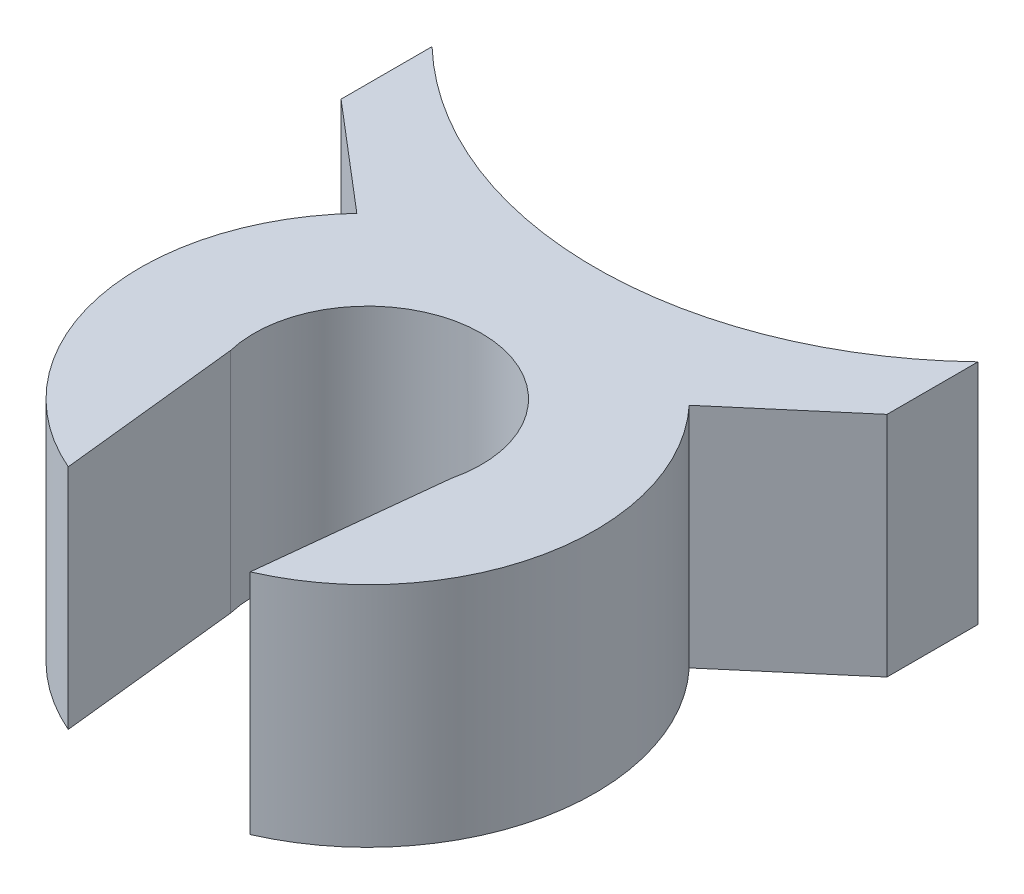
ISO-10303-21;
HEADER;
FILE_DESCRIPTION(('STEP AP214'),'2;1');
FILE_NAME('part.step','',(''),(''),'','','');
FILE_SCHEMA(('AUTOMOTIVE_DESIGN { 1 0 10303 214 1 1 1 1 }'));
ENDSEC;
DATA;
#1=APPLICATION_CONTEXT('core data for automotive mechanical design processes');
#2=APPLICATION_PROTOCOL_DEFINITION('international standard','automotive_design',2000,#1);
#3=PRODUCT_CONTEXT('',#1,'mechanical');
#4=PRODUCT('Part','Part','',(#3));
#5=PRODUCT_RELATED_PRODUCT_CATEGORY('part','',(#4));
#6=PRODUCT_DEFINITION_FORMATION('','',#4);
#7=PRODUCT_DEFINITION_CONTEXT('part definition',#1,'design');
#8=PRODUCT_DEFINITION('design','',#6,#7);
#9=PRODUCT_DEFINITION_SHAPE('','',#8);
#10=(LENGTH_UNIT() NAMED_UNIT(*) SI_UNIT(.MILLI.,.METRE.));
#11=(NAMED_UNIT(*) PLANE_ANGLE_UNIT() SI_UNIT($,.RADIAN.));
#12=(NAMED_UNIT(*) SI_UNIT($,.STERADIAN.) SOLID_ANGLE_UNIT());
#13=UNCERTAINTY_MEASURE_WITH_UNIT(LENGTH_MEASURE(1.E-05),#10,'distance_accuracy_value','');
#14=(GEOMETRIC_REPRESENTATION_CONTEXT(3) GLOBAL_UNCERTAINTY_ASSIGNED_CONTEXT((#13)) GLOBAL_UNIT_ASSIGNED_CONTEXT((#10,
#11,#12)) REPRESENTATION_CONTEXT('',''));
#15=CARTESIAN_POINT('',(0.,0.,0.));
#16=DIRECTION('',(0.,0.,1.));
#17=DIRECTION('',(1.,0.,0.));
#18=AXIS2_PLACEMENT_3D('',#15,#16,#17);
#19=CARTESIAN_POINT('',(0.,5.,0.));
#20=DIRECTION('',(0.,-1.,0.));
#21=DIRECTION('',(0.,0.,-1.));
#22=AXIS2_PLACEMENT_3D('',#19,#20,#21);
#23=CYLINDRICAL_SURFACE('',#22,5.);
#24=DIRECTION('',(0.,1.,0.));
#25=VECTOR('',#24,1.);
#26=CARTESIAN_POINT('',(-2.,-5.,4.58257569495584));
#27=LINE('',#26,#25);
#28=CARTESIAN_POINT('',(-2.,0.,4.58257569495584));
#29=VERTEX_POINT('',#28);
#30=CARTESIAN_POINT('',(-2.,5.,4.58257569495584));
#31=VERTEX_POINT('',#30);
#32=EDGE_CURVE('E205',#29,#31,#27,.T.);
#33=ORIENTED_EDGE('',*,*,#32,.T.);
#34=CARTESIAN_POINT('',(0.,5.,0.));
#35=DIRECTION('',(0.,1.,0.));
#36=DIRECTION('',(0.,0.,1.));
#37=AXIS2_PLACEMENT_3D('',#34,#35,#36);
#38=CIRCLE('',#37,5.);
#39=CARTESIAN_POINT('',(-3.65307531447136,5.,-3.41394797072245));
#40=VERTEX_POINT('',#39);
#41=EDGE_CURVE('E132',#40,#31,#38,.T.);
#42=ORIENTED_EDGE('',*,*,#41,.F.);
#43=DIRECTION('',(0.,-1.,0.));
#44=VECTOR('',#43,1.);
#45=CARTESIAN_POINT('',(-3.65307531447136,5.,-3.41394797072245));
#46=LINE('',#45,#44);
#47=CARTESIAN_POINT('',(-3.65307531447136,0.,-3.41394797072245));
#48=VERTEX_POINT('',#47);
#49=EDGE_CURVE('E155',#40,#48,#46,.T.);
#50=ORIENTED_EDGE('',*,*,#49,.T.);
#51=CARTESIAN_POINT('',(0.,0.,0.));
#52=DIRECTION('',(0.,1.,0.));
#53=DIRECTION('',(0.,0.,1.));
#54=AXIS2_PLACEMENT_3D('',#51,#52,#53);
#55=CIRCLE('',#54,5.);
#56=EDGE_CURVE('E148',#48,#29,#55,.T.);
#57=ORIENTED_EDGE('',*,*,#56,.T.);
#58=EDGE_LOOP('',(#33,#42,#50,#57));
#59=FACE_BOUND('',#58,.T.);
#60=ADVANCED_FACE('F37',(#59),#23,.T.);
#61=CARTESIAN_POINT('',(0.,5.,-13.6636384281383));
#62=DIRECTION('',(0.,1.,0.));
#63=DIRECTION('',(0.,0.,1.));
#64=AXIS2_PLACEMENT_3D('',#61,#62,#63);
#65=PLANE('',#64);
#66=DIRECTION('',(-0.761120289770479,0.,0.648610749602335));
#67=VECTOR('',#66,1.);
#68=CARTESIAN_POINT('',(3.65307531447136,5.,-3.41394797072246));
#69=LINE('',#68,#67);
#70=CARTESIAN_POINT('',(6.,5.,-5.41394797072245));
#71=VERTEX_POINT('',#70);
#72=CARTESIAN_POINT('',(3.65307531447136,5.,-3.41394797072246));
#73=VERTEX_POINT('',#72);
#74=EDGE_CURVE('E112',#71,#73,#69,.T.);
#75=ORIENTED_EDGE('',*,*,#74,.F.);
#76=DIRECTION('',(0.,0.,-1.));
#77=VECTOR('',#76,1.);
#78=CARTESIAN_POINT('',(6.,5.,-7.41394797072245));
#79=LINE('',#78,#77);
#80=CARTESIAN_POINT('',(6.,5.,-7.41394797072245));
#81=VERTEX_POINT('',#80);
#82=EDGE_CURVE('E120',#71,#81,#79,.T.);
#83=ORIENTED_EDGE('',*,*,#82,.T.);
#84=CARTESIAN_POINT('',(0.,5.,-13.6636384281383));
#85=DIRECTION('',(0.,-1.,0.));
#86=DIRECTION('',(0.,0.,1.));
#87=AXIS2_PLACEMENT_3D('',#84,#85,#86);
#88=CIRCLE('',#87,8.66363842813831);
#89=CARTESIAN_POINT('',(-6.,5.,-7.41394797072245));
#90=VERTEX_POINT('',#89);
#91=EDGE_CURVE('E152',#81,#90,#88,.T.);
#92=ORIENTED_EDGE('',*,*,#91,.T.);
#93=DIRECTION('',(0.,0.,1.));
#94=VECTOR('',#93,1.);
#95=CARTESIAN_POINT('',(-6.,5.,-7.41394797072245));
#96=LINE('',#95,#94);
#97=CARTESIAN_POINT('',(-6.,5.,-5.41394797072245));
#98=VERTEX_POINT('',#97);
#99=EDGE_CURVE('E184',#90,#98,#96,.T.);
#100=ORIENTED_EDGE('',*,*,#99,.T.);
#101=DIRECTION('',(-0.761120289770478,0.,-0.648610749602336));
#102=VECTOR('',#101,1.);
#103=CARTESIAN_POINT('',(-3.65307531447136,5.,-3.41394797072245));
#104=LINE('',#103,#102);
#105=EDGE_CURVE('E187',#40,#98,#104,.T.);
#106=ORIENTED_EDGE('',*,*,#105,.F.);
#107=ORIENTED_EDGE('',*,*,#41,.T.);
#108=DIRECTION('',(-0.107172581504937,0.,-0.994240432578342));
#109=VECTOR('',#108,1.);
#110=CARTESIAN_POINT('',(-2.4653258667171,5.,0.265745918924041));
#111=LINE('',#110,#109);
#112=CARTESIAN_POINT('',(-2.43117370001543,5.,0.582575694955839));
#113=VERTEX_POINT('',#112);
#114=EDGE_CURVE('E201',#31,#113,#111,.T.);
#115=ORIENTED_EDGE('',*,*,#114,.T.);
#116=CARTESIAN_POINT('',(0.,5.,0.));
#117=DIRECTION('',(0.,1.,0.));
#118=DIRECTION('',(0.,0.,1.));
#119=AXIS2_PLACEMENT_3D('',#116,#117,#118);
#120=CIRCLE('',#119,2.5);
#121=CARTESIAN_POINT('',(2.43117370001543,5.,0.582575694955839));
#122=VERTEX_POINT('',#121);
#123=EDGE_CURVE('E144',#122,#113,#120,.T.);
#124=ORIENTED_EDGE('',*,*,#123,.F.);
#125=DIRECTION('',(0.107172581504936,0.,-0.994240432578342));
#126=VECTOR('',#125,1.);
#127=CARTESIAN_POINT('',(2.4653258667171,5.,0.26574591892404));
#128=LINE('',#127,#126);
#129=CARTESIAN_POINT('',(2.,5.,4.58257569495584));
#130=VERTEX_POINT('',#129);
#131=EDGE_CURVE('E168',#130,#122,#128,.T.);
#132=ORIENTED_EDGE('',*,*,#131,.F.);
#133=EDGE_CURVE('E124',#130,#73,#38,.T.);
#134=ORIENTED_EDGE('',*,*,#133,.T.);
#135=EDGE_LOOP('',(#75,#83,#92,#100,#106,#107,#115,#124,#132,#134));
#136=FACE_BOUND('',#135,.T.);
#137=ADVANCED_FACE('F118',(#136),#65,.T.);
#138=CARTESIAN_POINT('',(0.,0.,-13.6636384281383));
#139=DIRECTION('',(0.,1.,0.));
#140=DIRECTION('',(0.,0.,1.));
#141=AXIS2_PLACEMENT_3D('',#138,#139,#140);
#142=PLANE('',#141);
#143=DIRECTION('',(0.,0.,-1.));
#144=VECTOR('',#143,1.);
#145=CARTESIAN_POINT('',(6.,0.,-7.41394797072245));
#146=LINE('',#145,#144);
#147=CARTESIAN_POINT('',(6.,0.,-5.41394797072245));
#148=VERTEX_POINT('',#147);
#149=CARTESIAN_POINT('',(6.,0.,-7.41394797072245));
#150=VERTEX_POINT('',#149);
#151=EDGE_CURVE('E151',#148,#150,#146,.T.);
#152=ORIENTED_EDGE('',*,*,#151,.F.);
#153=DIRECTION('',(-0.761120289770479,0.,0.648610749602335));
#154=VECTOR('',#153,1.);
#155=CARTESIAN_POINT('',(6.59680672876855,0.,-5.92253414943412));
#156=LINE('',#155,#154);
#157=CARTESIAN_POINT('',(3.65307531447136,0.,-3.41394797072246));
#158=VERTEX_POINT('',#157);
#159=EDGE_CURVE('E52',#148,#158,#156,.T.);
#160=ORIENTED_EDGE('',*,*,#159,.T.);
#161=CARTESIAN_POINT('',(2.,0.,4.58257569495584));
#162=VERTEX_POINT('',#161);
#163=EDGE_CURVE('E147',#162,#158,#55,.T.);
#164=ORIENTED_EDGE('',*,*,#163,.F.);
#165=DIRECTION('',(0.107172581504936,0.,-0.994240432578342));
#166=VECTOR('',#165,1.);
#167=CARTESIAN_POINT('',(3.92125914702254,0.,-13.240952474353));
#168=LINE('',#167,#166);
#169=CARTESIAN_POINT('',(2.43117370001543,0.,0.582575694955839));
#170=VERTEX_POINT('',#169);
#171=EDGE_CURVE('E166',#162,#170,#168,.T.);
#172=ORIENTED_EDGE('',*,*,#171,.T.);
#173=CARTESIAN_POINT('',(0.,0.,0.));
#174=DIRECTION('',(0.,1.,0.));
#175=DIRECTION('',(0.,0.,1.));
#176=AXIS2_PLACEMENT_3D('',#173,#174,#175);
#177=CIRCLE('',#176,2.5);
#178=CARTESIAN_POINT('',(-2.43117370001543,0.,0.582575694955839));
#179=VERTEX_POINT('',#178);
#180=EDGE_CURVE('E177',#170,#179,#177,.T.);
#181=ORIENTED_EDGE('',*,*,#180,.T.);
#182=DIRECTION('',(-0.107172581504937,0.,-0.994240432578342));
#183=VECTOR('',#182,1.);
#184=CARTESIAN_POINT('',(-3.92125914702254,0.,-13.240952474353));
#185=LINE('',#184,#183);
#186=EDGE_CURVE('E59',#29,#179,#185,.T.);
#187=ORIENTED_EDGE('',*,*,#186,.F.);
#188=ORIENTED_EDGE('',*,*,#56,.F.);
#189=DIRECTION('',(-0.761120289770478,0.,-0.648610749602336));
#190=VECTOR('',#189,1.);
#191=CARTESIAN_POINT('',(-6.59680672876856,0.,-5.92253414943413));
#192=LINE('',#191,#190);
#193=CARTESIAN_POINT('',(-6.,0.,-5.41394797072245));
#194=VERTEX_POINT('',#193);
#195=EDGE_CURVE('E199',#48,#194,#192,.T.);
#196=ORIENTED_EDGE('',*,*,#195,.T.);
#197=DIRECTION('',(0.,0.,1.));
#198=VECTOR('',#197,1.);
#199=CARTESIAN_POINT('',(-6.,0.,-7.41394797072245));
#200=LINE('',#199,#198);
#201=CARTESIAN_POINT('',(-6.,0.,-7.41394797072245));
#202=VERTEX_POINT('',#201);
#203=EDGE_CURVE('E143',#202,#194,#200,.T.);
#204=ORIENTED_EDGE('',*,*,#203,.F.);
#205=CARTESIAN_POINT('',(0.,0.,-13.6636384281383));
#206=DIRECTION('',(0.,-1.,0.));
#207=DIRECTION('',(0.,0.,1.));
#208=AXIS2_PLACEMENT_3D('',#205,#206,#207);
#209=CIRCLE('',#208,8.66363842813831);
#210=EDGE_CURVE('E140',#150,#202,#209,.T.);
#211=ORIENTED_EDGE('',*,*,#210,.F.);
#212=EDGE_LOOP('',(#152,#160,#164,#172,#181,#187,#188,#196,#204,#211));
#213=FACE_BOUND('',#212,.T.);
#214=ADVANCED_FACE('F176',(#213),#142,.F.);
#215=CARTESIAN_POINT('',(0.,5.,-13.6636384281383));
#216=DIRECTION('',(0.,-1.,0.));
#217=DIRECTION('',(0.,0.,-1.));
#218=AXIS2_PLACEMENT_3D('',#215,#216,#217);
#219=CYLINDRICAL_SURFACE('',#218,8.66363842813831);
#220=ORIENTED_EDGE('',*,*,#210,.T.);
#221=DIRECTION('',(0.,-1.,0.));
#222=VECTOR('',#221,1.);
#223=CARTESIAN_POINT('',(-6.,5.,-7.41394797072245));
#224=LINE('',#223,#222);
#225=EDGE_CURVE('E158',#90,#202,#224,.T.);
#226=ORIENTED_EDGE('',*,*,#225,.F.);
#227=ORIENTED_EDGE('',*,*,#91,.F.);
#228=DIRECTION('',(0.,-1.,0.));
#229=VECTOR('',#228,1.);
#230=CARTESIAN_POINT('',(6.,5.,-7.41394797072245));
#231=LINE('',#230,#229);
#232=EDGE_CURVE('E130',#81,#150,#231,.T.);
#233=ORIENTED_EDGE('',*,*,#232,.T.);
#234=EDGE_LOOP('',(#220,#226,#227,#233));
#235=FACE_BOUND('',#234,.T.);
#236=ADVANCED_FACE('F39',(#235),#219,.F.);
#237=CARTESIAN_POINT('',(-6.,5.,-7.41394797072245));
#238=DIRECTION('',(1.,0.,0.));
#239=DIRECTION('',(0.,0.,-1.));
#240=AXIS2_PLACEMENT_3D('',#237,#238,#239);
#241=PLANE('',#240);
#242=ORIENTED_EDGE('',*,*,#203,.T.);
#243=DIRECTION('',(0.,1.,0.));
#244=VECTOR('',#243,1.);
#245=CARTESIAN_POINT('',(-6.,-5.,-5.41394797072245));
#246=LINE('',#245,#244);
#247=EDGE_CURVE('E126',#194,#98,#246,.T.);
#248=ORIENTED_EDGE('',*,*,#247,.T.);
#249=ORIENTED_EDGE('',*,*,#99,.F.);
#250=ORIENTED_EDGE('',*,*,#225,.T.);
#251=EDGE_LOOP('',(#242,#248,#249,#250));
#252=FACE_BOUND('',#251,.T.);
#253=ADVANCED_FACE('F192',(#252),#241,.F.);
#254=ORIENTED_EDGE('',*,*,#133,.F.);
#255=DIRECTION('',(0.,1.,0.));
#256=VECTOR('',#255,1.);
#257=CARTESIAN_POINT('',(2.,-5.,4.58257569495584));
#258=LINE('',#257,#256);
#259=EDGE_CURVE('E206',#162,#130,#258,.T.);
#260=ORIENTED_EDGE('',*,*,#259,.F.);
#261=ORIENTED_EDGE('',*,*,#163,.T.);
#262=DIRECTION('',(0.,-1.,0.));
#263=VECTOR('',#262,1.);
#264=CARTESIAN_POINT('',(3.65307531447136,5.,-3.41394797072246));
#265=LINE('',#264,#263);
#266=EDGE_CURVE('E134',#73,#158,#265,.T.);
#267=ORIENTED_EDGE('',*,*,#266,.F.);
#268=EDGE_LOOP('',(#254,#260,#261,#267));
#269=FACE_BOUND('',#268,.T.);
#270=ADVANCED_FACE('F223',(#269),#23,.T.);
#271=CARTESIAN_POINT('',(6.,5.,-7.41394797072245));
#272=DIRECTION('',(-1.,0.,0.));
#273=DIRECTION('',(0.,0.,1.));
#274=AXIS2_PLACEMENT_3D('',#271,#272,#273);
#275=PLANE('',#274);
#276=ORIENTED_EDGE('',*,*,#82,.F.);
#277=DIRECTION('',(0.,-1.,0.));
#278=VECTOR('',#277,1.);
#279=CARTESIAN_POINT('',(6.,5.,-5.41394797072245));
#280=LINE('',#279,#278);
#281=EDGE_CURVE('E11',#71,#148,#280,.T.);
#282=ORIENTED_EDGE('',*,*,#281,.T.);
#283=ORIENTED_EDGE('',*,*,#151,.T.);
#284=ORIENTED_EDGE('',*,*,#232,.F.);
#285=EDGE_LOOP('',(#276,#282,#283,#284));
#286=FACE_BOUND('',#285,.T.);
#287=ADVANCED_FACE('F128',(#286),#275,.F.);
#288=CARTESIAN_POINT('',(0.,5.,0.));
#289=DIRECTION('',(0.,-1.,0.));
#290=DIRECTION('',(0.,0.,-1.));
#291=AXIS2_PLACEMENT_3D('',#288,#289,#290);
#292=CYLINDRICAL_SURFACE('',#291,2.5);
#293=DIRECTION('',(0.,-1.,0.));
#294=VECTOR('',#293,1.);
#295=CARTESIAN_POINT('',(2.43117370001543,5.,0.582575694955839));
#296=LINE('',#295,#294);
#297=EDGE_CURVE('E45',#122,#170,#296,.T.);
#298=ORIENTED_EDGE('',*,*,#297,.F.);
#299=ORIENTED_EDGE('',*,*,#123,.T.);
#300=DIRECTION('',(0.,-1.,0.));
#301=VECTOR('',#300,1.);
#302=CARTESIAN_POINT('',(-2.43117370001543,5.,0.582575694955839));
#303=LINE('',#302,#301);
#304=EDGE_CURVE('E161',#113,#179,#303,.T.);
#305=ORIENTED_EDGE('',*,*,#304,.T.);
#306=ORIENTED_EDGE('',*,*,#180,.F.);
#307=EDGE_LOOP('',(#298,#299,#305,#306));
#308=FACE_BOUND('',#307,.T.);
#309=ADVANCED_FACE('F180',(#308),#292,.F.);
#310=CARTESIAN_POINT('',(-2.4653258667171,-5.,0.265745918924041));
#311=DIRECTION('',(0.994240432578342,0.,-0.107172581504937));
#312=DIRECTION('',(-0.107172581504937,0.,-0.994240432578342));
#313=AXIS2_PLACEMENT_3D('',#310,#311,#312);
#314=PLANE('',#313);
#315=ORIENTED_EDGE('',*,*,#186,.T.);
#316=ORIENTED_EDGE('',*,*,#304,.F.);
#317=ORIENTED_EDGE('',*,*,#114,.F.);
#318=ORIENTED_EDGE('',*,*,#32,.F.);
#319=EDGE_LOOP('',(#315,#316,#317,#318));
#320=FACE_BOUND('',#319,.T.);
#321=ADVANCED_FACE('F212',(#320),#314,.T.);
#322=CARTESIAN_POINT('',(2.4653258667171,-5.,0.26574591892404));
#323=DIRECTION('',(0.994240432578342,0.,0.107172581504936));
#324=DIRECTION('',(0.107172581504936,0.,-0.994240432578342));
#325=AXIS2_PLACEMENT_3D('',#322,#323,#324);
#326=PLANE('',#325);
#327=ORIENTED_EDGE('',*,*,#259,.T.);
#328=ORIENTED_EDGE('',*,*,#131,.T.);
#329=ORIENTED_EDGE('',*,*,#297,.T.);
#330=ORIENTED_EDGE('',*,*,#171,.F.);
#331=EDGE_LOOP('',(#327,#328,#329,#330));
#332=FACE_BOUND('',#331,.T.);
#333=ADVANCED_FACE('F165',(#332),#326,.F.);
#334=CARTESIAN_POINT('',(3.65307531447136,-5.,-3.41394797072246));
#335=DIRECTION('',(-0.648610749602335,0.,-0.761120289770479));
#336=DIRECTION('',(-0.761120289770479,0.,0.648610749602335));
#337=AXIS2_PLACEMENT_3D('',#334,#335,#336);
#338=PLANE('',#337);
#339=ORIENTED_EDGE('',*,*,#281,.F.);
#340=ORIENTED_EDGE('',*,*,#74,.T.);
#341=ORIENTED_EDGE('',*,*,#266,.T.);
#342=ORIENTED_EDGE('',*,*,#159,.F.);
#343=EDGE_LOOP('',(#339,#340,#341,#342));
#344=FACE_BOUND('',#343,.T.);
#345=ADVANCED_FACE('F111',(#344),#338,.F.);
#346=CARTESIAN_POINT('',(-3.65307531447136,-5.,-3.41394797072245));
#347=DIRECTION('',(0.648610749602336,0.,-0.761120289770478));
#348=DIRECTION('',(-0.761120289770478,0.,-0.648610749602336));
#349=AXIS2_PLACEMENT_3D('',#346,#347,#348);
#350=PLANE('',#349);
#351=ORIENTED_EDGE('',*,*,#49,.F.);
#352=ORIENTED_EDGE('',*,*,#105,.T.);
#353=ORIENTED_EDGE('',*,*,#247,.F.);
#354=ORIENTED_EDGE('',*,*,#195,.F.);
#355=EDGE_LOOP('',(#351,#352,#353,#354));
#356=FACE_BOUND('',#355,.T.);
#357=ADVANCED_FACE('F298',(#356),#350,.F.);
#358=CLOSED_SHELL('',(#60,#137,#214,#236,#253,#270,#287,#309,#321,#333,#345,#357));
#359=MANIFOLD_SOLID_BREP('B2',#358);
#360=ADVANCED_BREP_SHAPE_REPRESENTATION('',(#18,#359),#14);
#361=SHAPE_DEFINITION_REPRESENTATION(#9,#360);
ENDSEC;
END-ISO-10303-21;
